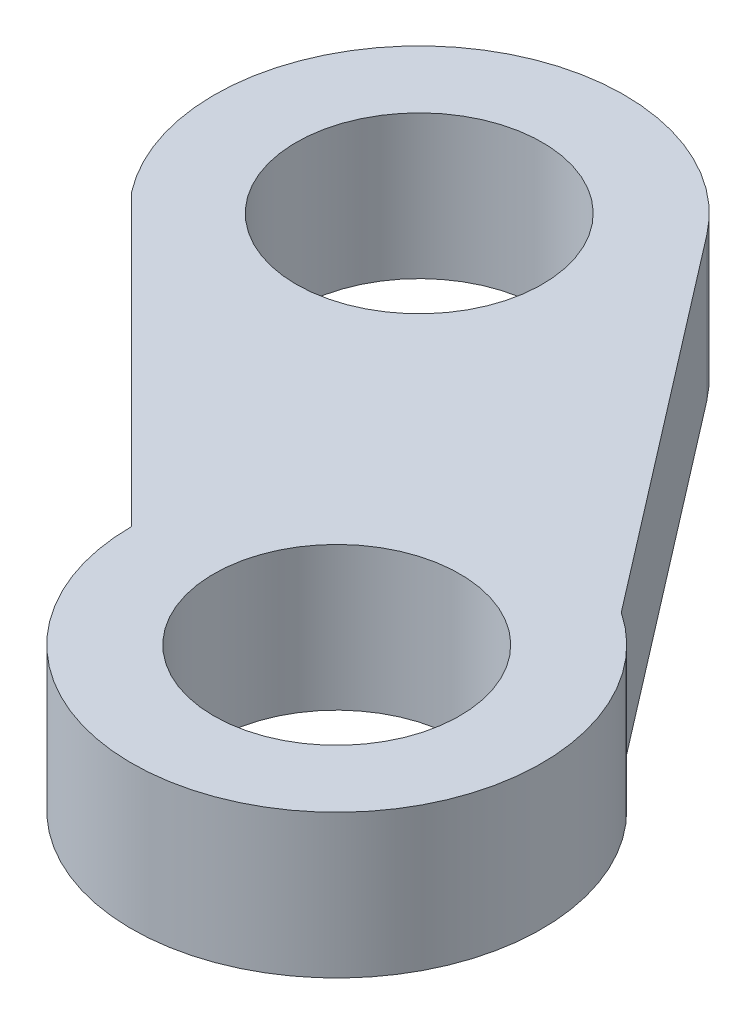
ISO-10303-21;
HEADER;
FILE_DESCRIPTION(('STEP AP214'),'2;1');
FILE_NAME('part.step','',(''),(''),'','','');
FILE_SCHEMA(('AUTOMOTIVE_DESIGN { 1 0 10303 214 1 1 1 1 }'));
ENDSEC;
DATA;
#1=APPLICATION_CONTEXT('core data for automotive mechanical design processes');
#2=APPLICATION_PROTOCOL_DEFINITION('international standard','automotive_design',2000,#1);
#3=PRODUCT_CONTEXT('',#1,'mechanical');
#4=PRODUCT('Part','Part','',(#3));
#5=PRODUCT_RELATED_PRODUCT_CATEGORY('part','',(#4));
#6=PRODUCT_DEFINITION_FORMATION('','',#4);
#7=PRODUCT_DEFINITION_CONTEXT('part definition',#1,'design');
#8=PRODUCT_DEFINITION('design','',#6,#7);
#9=PRODUCT_DEFINITION_SHAPE('','',#8);
#10=(LENGTH_UNIT() NAMED_UNIT(*) SI_UNIT(.MILLI.,.METRE.));
#11=(NAMED_UNIT(*) PLANE_ANGLE_UNIT() SI_UNIT($,.RADIAN.));
#12=(NAMED_UNIT(*) SI_UNIT($,.STERADIAN.) SOLID_ANGLE_UNIT());
#13=UNCERTAINTY_MEASURE_WITH_UNIT(LENGTH_MEASURE(1.E-05),#10,'distance_accuracy_value','');
#14=(GEOMETRIC_REPRESENTATION_CONTEXT(3) GLOBAL_UNCERTAINTY_ASSIGNED_CONTEXT((#13)) GLOBAL_UNIT_ASSIGNED_CONTEXT((#10,
#11,#12)) REPRESENTATION_CONTEXT('',''));
#15=CARTESIAN_POINT('',(0.,0.,0.));
#16=DIRECTION('',(0.,0.,1.));
#17=DIRECTION('',(1.,0.,0.));
#18=AXIS2_PLACEMENT_3D('',#15,#16,#17);
#19=CARTESIAN_POINT('',(37.5708353041291,35.,-28.8786358094863));
#20=DIRECTION('',(-0.792848367993298,0.,0.609418957180004));
#21=DIRECTION('',(0.609418957180004,0.,0.792848367993298));
#22=AXIS2_PLACEMENT_3D('',#19,#20,#21);
#23=PLANE('',#22);
#24=DIRECTION('',(-0.609418957180004,0.,-0.792848367993298));
#25=VECTOR('',#24,1.);
#26=CARTESIAN_POINT('',(37.5708353041291,0.,-28.8786358094863));
#27=LINE('',#26,#25);
#28=CARTESIAN_POINT('',(27.8495670119275,0.,-41.5259150079581));
#29=VERTEX_POINT('',#28);
#30=CARTESIAN_POINT('',(-41.4258413193248,0.,-131.652573836655));
#31=VERTEX_POINT('',#30);
#32=EDGE_CURVE('E117',#29,#31,#27,.T.);
#33=ORIENTED_EDGE('',*,*,#32,.T.);
#34=DIRECTION('',(0.,-1.,0.));
#35=VECTOR('',#34,1.);
#36=CARTESIAN_POINT('',(-41.4258413193248,35.,-131.652573836655));
#37=LINE('',#36,#35);
#38=CARTESIAN_POINT('',(-41.4258413193248,35.,-131.652573836655));
#39=VERTEX_POINT('',#38);
#40=EDGE_CURVE('E11',#39,#31,#37,.T.);
#41=ORIENTED_EDGE('',*,*,#40,.F.);
#42=DIRECTION('',(-0.609418957180004,0.,-0.792848367993298));
#43=VECTOR('',#42,1.);
#44=CARTESIAN_POINT('',(37.5708353041291,35.,-28.8786358094863));
#45=LINE('',#44,#43);
#46=CARTESIAN_POINT('',(27.8495670119275,35.,-41.5259150079581));
#47=VERTEX_POINT('',#46);
#48=EDGE_CURVE('E90',#47,#39,#45,.T.);
#49=ORIENTED_EDGE('',*,*,#48,.F.);
#50=DIRECTION('',(0.,-1.,0.));
#51=VECTOR('',#50,1.);
#52=CARTESIAN_POINT('',(27.8495670119275,35.,-41.5259150079581));
#53=LINE('',#52,#51);
#54=EDGE_CURVE('E105',#47,#29,#53,.T.);
#55=ORIENTED_EDGE('',*,*,#54,.T.);
#56=EDGE_LOOP('',(#33,#41,#49,#55));
#57=FACE_BOUND('',#56,.T.);
#58=ADVANCED_FACE('F41',(#57),#23,.F.);
#59=CARTESIAN_POINT('',(-81.0682597189897,35.,-101.181625977655));
#60=DIRECTION('',(0.,-1.,0.));
#61=DIRECTION('',(0.,0.,-1.));
#62=AXIS2_PLACEMENT_3D('',#59,#60,#61);
#63=CYLINDRICAL_SURFACE('',#62,50.);
#64=CARTESIAN_POINT('',(-81.0682597189897,0.,-101.181625977655));
#65=DIRECTION('',(0.,1.,0.));
#66=DIRECTION('',(0.,0.,1.));
#67=AXIS2_PLACEMENT_3D('',#64,#65,#66);
#68=CIRCLE('',#67,50.);
#69=CARTESIAN_POINT('',(-120.710678118655,0.,-70.7106781186549));
#70=VERTEX_POINT('',#69);
#71=EDGE_CURVE('E96',#31,#70,#68,.T.);
#72=ORIENTED_EDGE('',*,*,#71,.T.);
#73=DIRECTION('',(0.,-1.,0.));
#74=VECTOR('',#73,1.);
#75=CARTESIAN_POINT('',(-120.710678118655,35.,-70.7106781186549));
#76=LINE('',#75,#74);
#77=CARTESIAN_POINT('',(-120.710678118655,35.,-70.7106781186549));
#78=VERTEX_POINT('',#77);
#79=EDGE_CURVE('E51',#78,#70,#76,.T.);
#80=ORIENTED_EDGE('',*,*,#79,.F.);
#81=CARTESIAN_POINT('',(-81.0682597189897,35.,-101.181625977655));
#82=DIRECTION('',(0.,1.,0.));
#83=DIRECTION('',(0.,0.,1.));
#84=AXIS2_PLACEMENT_3D('',#81,#82,#83);
#85=CIRCLE('',#84,50.);
#86=EDGE_CURVE('E85',#39,#78,#85,.T.);
#87=ORIENTED_EDGE('',*,*,#86,.F.);
#88=ORIENTED_EDGE('',*,*,#40,.T.);
#89=EDGE_LOOP('',(#72,#80,#87,#88));
#90=FACE_BOUND('',#89,.T.);
#91=ADVANCED_FACE('F95',(#90),#63,.T.);
#92=CARTESIAN_POINT('',(-25.0000000000001,35.,25.));
#93=DIRECTION('',(-0.707106781186549,0.,0.707106781186546));
#94=DIRECTION('',(0.707106781186546,0.,0.707106781186549));
#95=AXIS2_PLACEMENT_3D('',#92,#93,#94);
#96=PLANE('',#95);
#97=DIRECTION('',(-0.707106781186546,0.,-0.707106781186549));
#98=VECTOR('',#97,1.);
#99=CARTESIAN_POINT('',(-25.0000000000001,0.,25.));
#100=LINE('',#99,#98);
#101=CARTESIAN_POINT('',(-50.,0.,0.));
#102=VERTEX_POINT('',#101);
#103=EDGE_CURVE('E123',#102,#70,#100,.T.);
#104=ORIENTED_EDGE('',*,*,#103,.F.);
#105=DIRECTION('',(0.,-1.,0.));
#106=VECTOR('',#105,1.);
#107=CARTESIAN_POINT('',(-50.,35.,0.));
#108=LINE('',#107,#106);
#109=CARTESIAN_POINT('',(-50.,35.,0.));
#110=VERTEX_POINT('',#109);
#111=EDGE_CURVE('E75',#110,#102,#108,.T.);
#112=ORIENTED_EDGE('',*,*,#111,.F.);
#113=DIRECTION('',(-0.707106781186546,0.,-0.707106781186549));
#114=VECTOR('',#113,1.);
#115=CARTESIAN_POINT('',(-25.0000000000001,35.,25.));
#116=LINE('',#115,#114);
#117=EDGE_CURVE('E88',#110,#78,#116,.T.);
#118=ORIENTED_EDGE('',*,*,#117,.T.);
#119=ORIENTED_EDGE('',*,*,#79,.T.);
#120=EDGE_LOOP('',(#104,#112,#118,#119));
#121=FACE_BOUND('',#120,.T.);
#122=ADVANCED_FACE('F101',(#121),#96,.T.);
#123=CARTESIAN_POINT('',(-81.0682597189897,35.,-101.181625977655));
#124=DIRECTION('',(0.,-1.,0.));
#125=DIRECTION('',(0.,0.,-1.));
#126=AXIS2_PLACEMENT_3D('',#123,#124,#125);
#127=CYLINDRICAL_SURFACE('',#126,30.);
#128=CARTESIAN_POINT('',(-81.0682597189897,35.,-101.181625977655));
#129=DIRECTION('',(0.,1.,0.));
#130=DIRECTION('',(0.,0.,1.));
#131=AXIS2_PLACEMENT_3D('',#128,#129,#130);
#132=CIRCLE('',#131,30.);
#133=CARTESIAN_POINT('',(-81.0682597189897,35.,-71.1816259776551));
#134=VERTEX_POINT('',#133);
#135=EDGE_CURVE('E165',#134,#134,#132,.T.);
#136=ORIENTED_EDGE('',*,*,#135,.T.);
#137=EDGE_LOOP('',(#136));
#138=FACE_BOUND('',#137,.T.);
#139=CARTESIAN_POINT('',(-81.0682597189897,0.,-101.181625977655));
#140=DIRECTION('',(0.,1.,0.));
#141=DIRECTION('',(0.,0.,1.));
#142=AXIS2_PLACEMENT_3D('',#139,#140,#141);
#143=CIRCLE('',#142,30.);
#144=CARTESIAN_POINT('',(-81.0682597189897,0.,-71.1816259776551));
#145=VERTEX_POINT('',#144);
#146=EDGE_CURVE('E113',#145,#145,#143,.T.);
#147=ORIENTED_EDGE('',*,*,#146,.F.);
#148=EDGE_LOOP('',(#147));
#149=FACE_BOUND('',#148,.T.);
#150=ADVANCED_FACE('F154',(#138,#149),#127,.F.);
#151=CARTESIAN_POINT('',(0.,35.,0.));
#152=DIRECTION('',(0.,-1.,0.));
#153=DIRECTION('',(0.,0.,-1.));
#154=AXIS2_PLACEMENT_3D('',#151,#152,#153);
#155=CYLINDRICAL_SURFACE('',#154,30.);
#156=CARTESIAN_POINT('',(0.,35.,0.));
#157=DIRECTION('',(0.,1.,0.));
#158=DIRECTION('',(0.,0.,1.));
#159=AXIS2_PLACEMENT_3D('',#156,#157,#158);
#160=CIRCLE('',#159,30.);
#161=CARTESIAN_POINT('',(0.,35.,30.));
#162=VERTEX_POINT('',#161);
#163=EDGE_CURVE('E128',#162,#162,#160,.T.);
#164=ORIENTED_EDGE('',*,*,#163,.T.);
#165=EDGE_LOOP('',(#164));
#166=FACE_BOUND('',#165,.T.);
#167=CARTESIAN_POINT('',(0.,0.,0.));
#168=DIRECTION('',(0.,1.,0.));
#169=DIRECTION('',(0.,0.,1.));
#170=AXIS2_PLACEMENT_3D('',#167,#168,#169);
#171=CIRCLE('',#170,30.);
#172=CARTESIAN_POINT('',(0.,0.,30.));
#173=VERTEX_POINT('',#172);
#174=EDGE_CURVE('E109',#173,#173,#171,.T.);
#175=ORIENTED_EDGE('',*,*,#174,.F.);
#176=EDGE_LOOP('',(#175));
#177=FACE_BOUND('',#176,.T.);
#178=ADVANCED_FACE('F43',(#166,#177),#155,.F.);
#179=CARTESIAN_POINT('',(0.,35.,0.));
#180=DIRECTION('',(0.,-1.,0.));
#181=DIRECTION('',(0.,0.,-1.));
#182=AXIS2_PLACEMENT_3D('',#179,#180,#181);
#183=CYLINDRICAL_SURFACE('',#182,50.);
#184=CARTESIAN_POINT('',(0.,0.,0.));
#185=DIRECTION('',(0.,1.,0.));
#186=DIRECTION('',(0.,0.,1.));
#187=AXIS2_PLACEMENT_3D('',#184,#185,#186);
#188=CIRCLE('',#187,50.);
#189=EDGE_CURVE('E78',#102,#29,#188,.T.);
#190=ORIENTED_EDGE('',*,*,#189,.T.);
#191=ORIENTED_EDGE('',*,*,#54,.F.);
#192=CARTESIAN_POINT('',(0.,35.,0.));
#193=DIRECTION('',(0.,1.,0.));
#194=DIRECTION('',(0.,0.,1.));
#195=AXIS2_PLACEMENT_3D('',#192,#193,#194);
#196=CIRCLE('',#195,50.);
#197=EDGE_CURVE('E59',#110,#47,#196,.T.);
#198=ORIENTED_EDGE('',*,*,#197,.F.);
#199=ORIENTED_EDGE('',*,*,#111,.T.);
#200=EDGE_LOOP('',(#190,#191,#198,#199));
#201=FACE_BOUND('',#200,.T.);
#202=ADVANCED_FACE('F142',(#201),#183,.T.);
#203=CARTESIAN_POINT('',(0.,35.,0.));
#204=DIRECTION('',(0.,1.,0.));
#205=DIRECTION('',(0.,0.,1.));
#206=AXIS2_PLACEMENT_3D('',#203,#204,#205);
#207=PLANE('',#206);
#208=ORIENTED_EDGE('',*,*,#163,.F.);
#209=EDGE_LOOP('',(#208));
#210=FACE_BOUND('',#209,.T.);
#211=ORIENTED_EDGE('',*,*,#135,.F.);
#212=EDGE_LOOP('',(#211));
#213=FACE_BOUND('',#212,.T.);
#214=ORIENTED_EDGE('',*,*,#48,.T.);
#215=ORIENTED_EDGE('',*,*,#86,.T.);
#216=ORIENTED_EDGE('',*,*,#117,.F.);
#217=ORIENTED_EDGE('',*,*,#197,.T.);
#218=EDGE_LOOP('',(#214,#215,#216,#217));
#219=FACE_BOUND('',#218,.T.);
#220=ADVANCED_FACE('F86',(#210,#213,#219),#207,.T.);
#221=CARTESIAN_POINT('',(0.,0.,0.));
#222=DIRECTION('',(0.,1.,0.));
#223=DIRECTION('',(0.,0.,1.));
#224=AXIS2_PLACEMENT_3D('',#221,#222,#223);
#225=PLANE('',#224);
#226=ORIENTED_EDGE('',*,*,#174,.T.);
#227=EDGE_LOOP('',(#226));
#228=FACE_BOUND('',#227,.T.);
#229=ORIENTED_EDGE('',*,*,#146,.T.);
#230=EDGE_LOOP('',(#229));
#231=FACE_BOUND('',#230,.T.);
#232=ORIENTED_EDGE('',*,*,#32,.F.);
#233=ORIENTED_EDGE('',*,*,#189,.F.);
#234=ORIENTED_EDGE('',*,*,#103,.T.);
#235=ORIENTED_EDGE('',*,*,#71,.F.);
#236=EDGE_LOOP('',(#232,#233,#234,#235));
#237=FACE_BOUND('',#236,.T.);
#238=ADVANCED_FACE('F135',(#228,#231,#237),#225,.F.);
#239=CLOSED_SHELL('',(#58,#91,#122,#150,#178,#202,#220,#238));
#240=MANIFOLD_SOLID_BREP('B2',#239);
#241=ADVANCED_BREP_SHAPE_REPRESENTATION('',(#18,#240),#14);
#242=SHAPE_DEFINITION_REPRESENTATION(#9,#241);
ENDSEC;
END-ISO-10303-21;
